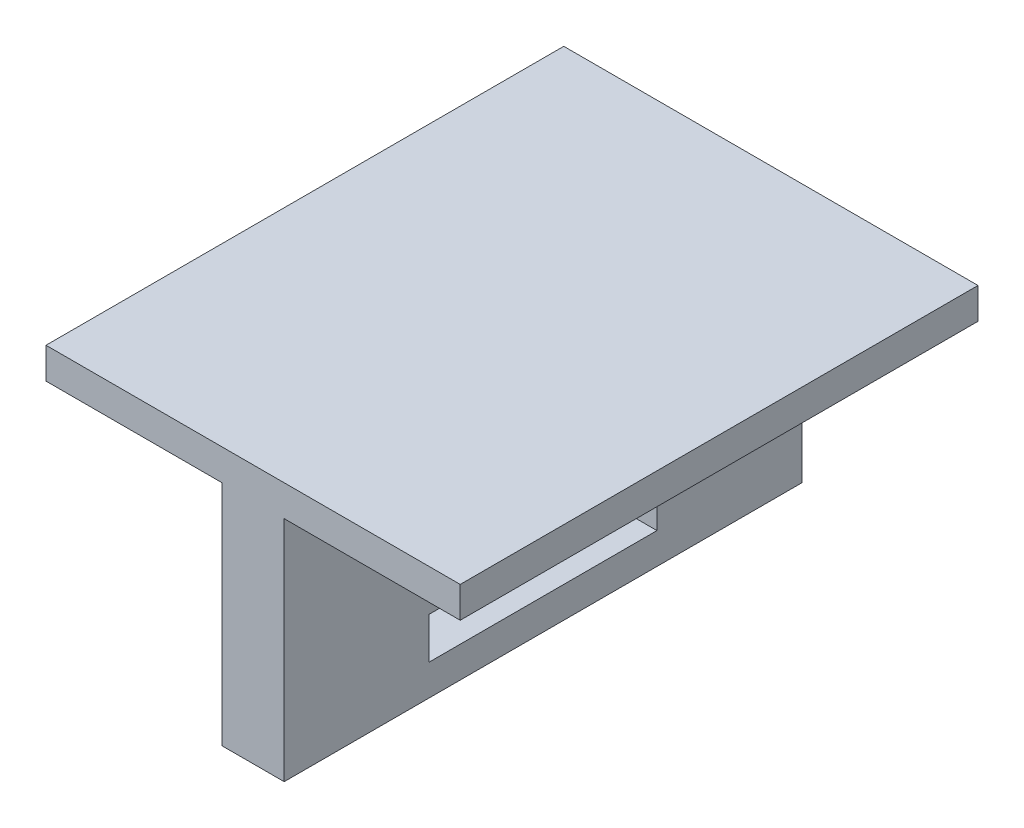
ISO-10303-21;
HEADER;
FILE_DESCRIPTION(('STEP AP214'),'2;1');
FILE_NAME('part.step','',(''),(''),'','','');
FILE_SCHEMA(('AUTOMOTIVE_DESIGN { 1 0 10303 214 1 1 1 1 }'));
ENDSEC;
DATA;
#1=APPLICATION_CONTEXT('core data for automotive mechanical design processes');
#2=APPLICATION_PROTOCOL_DEFINITION('international standard','automotive_design',2000,#1);
#3=PRODUCT_CONTEXT('',#1,'mechanical');
#4=PRODUCT('Part','Part','',(#3));
#5=PRODUCT_RELATED_PRODUCT_CATEGORY('part','',(#4));
#6=PRODUCT_DEFINITION_FORMATION('','',#4);
#7=PRODUCT_DEFINITION_CONTEXT('part definition',#1,'design');
#8=PRODUCT_DEFINITION('design','',#6,#7);
#9=PRODUCT_DEFINITION_SHAPE('','',#8);
#10=(LENGTH_UNIT() NAMED_UNIT(*) SI_UNIT(.MILLI.,.METRE.));
#11=(NAMED_UNIT(*) PLANE_ANGLE_UNIT() SI_UNIT($,.RADIAN.));
#12=(NAMED_UNIT(*) SI_UNIT($,.STERADIAN.) SOLID_ANGLE_UNIT());
#13=UNCERTAINTY_MEASURE_WITH_UNIT(LENGTH_MEASURE(1.E-05),#10,'distance_accuracy_value','');
#14=(GEOMETRIC_REPRESENTATION_CONTEXT(3) GLOBAL_UNCERTAINTY_ASSIGNED_CONTEXT((#13)) GLOBAL_UNIT_ASSIGNED_CONTEXT((#10,
#11,#12)) REPRESENTATION_CONTEXT('',''));
#15=CARTESIAN_POINT('',(0.,0.,0.));
#16=DIRECTION('',(0.,0.,1.));
#17=DIRECTION('',(1.,0.,0.));
#18=AXIS2_PLACEMENT_3D('',#15,#16,#17);
#19=CARTESIAN_POINT('',(-3.,-12.5,0.));
#20=DIRECTION('',(0.,-1.,0.));
#21=DIRECTION('',(0.,0.,-1.));
#22=AXIS2_PLACEMENT_3D('',#19,#20,#21);
#23=PLANE('',#22);
#24=DIRECTION('',(1.,0.,0.));
#25=VECTOR('',#24,1.);
#26=CARTESIAN_POINT('',(-3.,-12.5,-25.));
#27=LINE('',#26,#25);
#28=CARTESIAN_POINT('',(-3.,-12.5,-25.));
#29=VERTEX_POINT('',#28);
#30=CARTESIAN_POINT('',(3.,-12.5,-25.));
#31=VERTEX_POINT('',#30);
#32=EDGE_CURVE('E42',#29,#31,#27,.T.);
#33=ORIENTED_EDGE('',*,*,#32,.T.);
#34=DIRECTION('',(0.,0.,-1.));
#35=VECTOR('',#34,1.);
#36=CARTESIAN_POINT('',(3.,-12.5,0.));
#37=LINE('',#36,#35);
#38=CARTESIAN_POINT('',(3.,-12.5,25.));
#39=VERTEX_POINT('',#38);
#40=EDGE_CURVE('E193',#39,#31,#37,.T.);
#41=ORIENTED_EDGE('',*,*,#40,.F.);
#42=DIRECTION('',(1.,0.,0.));
#43=VECTOR('',#42,1.);
#44=CARTESIAN_POINT('',(-3.,-12.5,25.));
#45=LINE('',#44,#43);
#46=CARTESIAN_POINT('',(-3.,-12.5,25.));
#47=VERTEX_POINT('',#46);
#48=EDGE_CURVE('E11',#47,#39,#45,.T.);
#49=ORIENTED_EDGE('',*,*,#48,.F.);
#50=DIRECTION('',(0.,0.,-1.));
#51=VECTOR('',#50,1.);
#52=CARTESIAN_POINT('',(-3.,-12.5,0.));
#53=LINE('',#52,#51);
#54=EDGE_CURVE('E212',#47,#29,#53,.T.);
#55=ORIENTED_EDGE('',*,*,#54,.T.);
#56=EDGE_LOOP('',(#33,#41,#49,#55));
#57=FACE_BOUND('',#56,.T.);
#58=ADVANCED_FACE('F33',(#57),#23,.T.);
#59=CARTESIAN_POINT('',(-3.,0.,25.));
#60=DIRECTION('',(0.,0.,-1.));
#61=DIRECTION('',(-1.,0.,0.));
#62=AXIS2_PLACEMENT_3D('',#59,#60,#61);
#63=PLANE('',#62);
#64=ORIENTED_EDGE('',*,*,#48,.T.);
#65=DIRECTION('',(0.,1.,0.));
#66=VECTOR('',#65,1.);
#67=CARTESIAN_POINT('',(3.,0.,25.));
#68=LINE('',#67,#66);
#69=CARTESIAN_POINT('',(3.,9.50000000000001,25.));
#70=VERTEX_POINT('',#69);
#71=EDGE_CURVE('E185',#39,#70,#68,.T.);
#72=ORIENTED_EDGE('',*,*,#71,.T.);
#73=DIRECTION('',(1.,0.,0.));
#74=VECTOR('',#73,1.);
#75=CARTESIAN_POINT('',(-20.,9.50000000000001,25.));
#76=LINE('',#75,#74);
#77=CARTESIAN_POINT('',(20.,9.50000000000001,25.));
#78=VERTEX_POINT('',#77);
#79=EDGE_CURVE('E168',#70,#78,#76,.T.);
#80=ORIENTED_EDGE('',*,*,#79,.T.);
#81=DIRECTION('',(0.,1.,0.));
#82=VECTOR('',#81,1.);
#83=CARTESIAN_POINT('',(20.,0.,25.));
#84=LINE('',#83,#82);
#85=CARTESIAN_POINT('',(20.,12.5,25.));
#86=VERTEX_POINT('',#85);
#87=EDGE_CURVE('E150',#78,#86,#84,.T.);
#88=ORIENTED_EDGE('',*,*,#87,.T.);
#89=DIRECTION('',(1.,0.,0.));
#90=VECTOR('',#89,1.);
#91=CARTESIAN_POINT('',(-20.,12.5,25.));
#92=LINE('',#91,#90);
#93=CARTESIAN_POINT('',(-20.,12.5,25.));
#94=VERTEX_POINT('',#93);
#95=EDGE_CURVE('E164',#94,#86,#92,.T.);
#96=ORIENTED_EDGE('',*,*,#95,.F.);
#97=DIRECTION('',(0.,1.,0.));
#98=VECTOR('',#97,1.);
#99=CARTESIAN_POINT('',(-20.,0.,25.));
#100=LINE('',#99,#98);
#101=CARTESIAN_POINT('',(-20.,9.50000000000001,25.));
#102=VERTEX_POINT('',#101);
#103=EDGE_CURVE('E134',#102,#94,#100,.T.);
#104=ORIENTED_EDGE('',*,*,#103,.F.);
#105=CARTESIAN_POINT('',(-3.,9.50000000000001,25.));
#106=VERTEX_POINT('',#105);
#107=EDGE_CURVE('E171',#102,#106,#76,.T.);
#108=ORIENTED_EDGE('',*,*,#107,.T.);
#109=DIRECTION('',(0.,1.,0.));
#110=VECTOR('',#109,1.);
#111=CARTESIAN_POINT('',(-3.,0.,25.));
#112=LINE('',#111,#110);
#113=EDGE_CURVE('E221',#47,#106,#112,.T.);
#114=ORIENTED_EDGE('',*,*,#113,.F.);
#115=EDGE_LOOP('',(#64,#72,#80,#88,#96,#104,#108,#114));
#116=FACE_BOUND('',#115,.T.);
#117=ADVANCED_FACE('F183',(#116),#63,.F.);
#118=CARTESIAN_POINT('',(-3.,0.,-11.));
#119=DIRECTION('',(0.,0.,-1.));
#120=DIRECTION('',(-1.,0.,0.));
#121=AXIS2_PLACEMENT_3D('',#118,#119,#120);
#122=PLANE('',#121);
#123=DIRECTION('',(1.,0.,0.));
#124=VECTOR('',#123,1.);
#125=CARTESIAN_POINT('',(-3.,-9.5,-11.));
#126=LINE('',#125,#124);
#127=CARTESIAN_POINT('',(-3.,-9.5,-11.));
#128=VERTEX_POINT('',#127);
#129=CARTESIAN_POINT('',(3.,-9.5,-11.));
#130=VERTEX_POINT('',#129);
#131=EDGE_CURVE('E222',#128,#130,#126,.T.);
#132=ORIENTED_EDGE('',*,*,#131,.T.);
#133=DIRECTION('',(0.,1.,0.));
#134=VECTOR('',#133,1.);
#135=CARTESIAN_POINT('',(3.,0.,-11.));
#136=LINE('',#135,#134);
#137=CARTESIAN_POINT('',(3.,-5.5,-11.));
#138=VERTEX_POINT('',#137);
#139=EDGE_CURVE('E173',#130,#138,#136,.T.);
#140=ORIENTED_EDGE('',*,*,#139,.T.);
#141=DIRECTION('',(1.,0.,0.));
#142=VECTOR('',#141,1.);
#143=CARTESIAN_POINT('',(-3.,-5.5,-11.));
#144=LINE('',#143,#142);
#145=CARTESIAN_POINT('',(-3.,-5.5,-11.));
#146=VERTEX_POINT('',#145);
#147=EDGE_CURVE('E240',#146,#138,#144,.T.);
#148=ORIENTED_EDGE('',*,*,#147,.F.);
#149=DIRECTION('',(0.,1.,0.));
#150=VECTOR('',#149,1.);
#151=CARTESIAN_POINT('',(-3.,0.,-11.));
#152=LINE('',#151,#150);
#153=EDGE_CURVE('E191',#128,#146,#152,.T.);
#154=ORIENTED_EDGE('',*,*,#153,.F.);
#155=EDGE_LOOP('',(#132,#140,#148,#154));
#156=FACE_BOUND('',#155,.T.);
#157=ADVANCED_FACE('F35',(#156),#122,.F.);
#158=CARTESIAN_POINT('',(-3.,-5.5,0.));
#159=DIRECTION('',(0.,-1.,0.));
#160=DIRECTION('',(0.,0.,-1.));
#161=AXIS2_PLACEMENT_3D('',#158,#159,#160);
#162=PLANE('',#161);
#163=ORIENTED_EDGE('',*,*,#147,.T.);
#164=DIRECTION('',(0.,0.,-1.));
#165=VECTOR('',#164,1.);
#166=CARTESIAN_POINT('',(3.,-5.5,0.));
#167=LINE('',#166,#165);
#168=CARTESIAN_POINT('',(3.,-5.5,11.));
#169=VERTEX_POINT('',#168);
#170=EDGE_CURVE('E244',#169,#138,#167,.T.);
#171=ORIENTED_EDGE('',*,*,#170,.F.);
#172=DIRECTION('',(1.,0.,0.));
#173=VECTOR('',#172,1.);
#174=CARTESIAN_POINT('',(-3.,-5.5,11.));
#175=LINE('',#174,#173);
#176=CARTESIAN_POINT('',(-3.,-5.5,11.));
#177=VERTEX_POINT('',#176);
#178=EDGE_CURVE('E235',#177,#169,#175,.T.);
#179=ORIENTED_EDGE('',*,*,#178,.F.);
#180=DIRECTION('',(0.,0.,-1.));
#181=VECTOR('',#180,1.);
#182=CARTESIAN_POINT('',(-3.,-5.5,0.));
#183=LINE('',#182,#181);
#184=EDGE_CURVE('E209',#177,#146,#183,.T.);
#185=ORIENTED_EDGE('',*,*,#184,.T.);
#186=EDGE_LOOP('',(#163,#171,#179,#185));
#187=FACE_BOUND('',#186,.T.);
#188=ADVANCED_FACE('F263',(#187),#162,.T.);
#189=CARTESIAN_POINT('',(-3.,0.,11.));
#190=DIRECTION('',(0.,0.,-1.));
#191=DIRECTION('',(-1.,0.,0.));
#192=AXIS2_PLACEMENT_3D('',#189,#190,#191);
#193=PLANE('',#192);
#194=ORIENTED_EDGE('',*,*,#178,.T.);
#195=DIRECTION('',(0.,1.,0.));
#196=VECTOR('',#195,1.);
#197=CARTESIAN_POINT('',(3.,0.,11.));
#198=LINE('',#197,#196);
#199=CARTESIAN_POINT('',(3.,-9.5,11.));
#200=VERTEX_POINT('',#199);
#201=EDGE_CURVE('E246',#200,#169,#198,.T.);
#202=ORIENTED_EDGE('',*,*,#201,.F.);
#203=DIRECTION('',(1.,0.,0.));
#204=VECTOR('',#203,1.);
#205=CARTESIAN_POINT('',(-3.,-9.5,11.));
#206=LINE('',#205,#204);
#207=CARTESIAN_POINT('',(-3.,-9.5,11.));
#208=VERTEX_POINT('',#207);
#209=EDGE_CURVE('E229',#208,#200,#206,.T.);
#210=ORIENTED_EDGE('',*,*,#209,.F.);
#211=DIRECTION('',(0.,1.,0.));
#212=VECTOR('',#211,1.);
#213=CARTESIAN_POINT('',(-3.,0.,11.));
#214=LINE('',#213,#212);
#215=EDGE_CURVE('E206',#208,#177,#214,.T.);
#216=ORIENTED_EDGE('',*,*,#215,.T.);
#217=EDGE_LOOP('',(#194,#202,#210,#216));
#218=FACE_BOUND('',#217,.T.);
#219=ADVANCED_FACE('F261',(#218),#193,.T.);
#220=CARTESIAN_POINT('',(-3.,-9.5,0.));
#221=DIRECTION('',(0.,-1.,0.));
#222=DIRECTION('',(0.,0.,-1.));
#223=AXIS2_PLACEMENT_3D('',#220,#221,#222);
#224=PLANE('',#223);
#225=ORIENTED_EDGE('',*,*,#209,.T.);
#226=DIRECTION('',(0.,0.,-1.));
#227=VECTOR('',#226,1.);
#228=CARTESIAN_POINT('',(3.,-9.5,0.));
#229=LINE('',#228,#227);
#230=EDGE_CURVE('E250',#200,#130,#229,.T.);
#231=ORIENTED_EDGE('',*,*,#230,.T.);
#232=ORIENTED_EDGE('',*,*,#131,.F.);
#233=DIRECTION('',(0.,0.,-1.));
#234=VECTOR('',#233,1.);
#235=CARTESIAN_POINT('',(-3.,-9.5,0.));
#236=LINE('',#235,#234);
#237=EDGE_CURVE('E204',#208,#128,#236,.T.);
#238=ORIENTED_EDGE('',*,*,#237,.F.);
#239=EDGE_LOOP('',(#225,#231,#232,#238));
#240=FACE_BOUND('',#239,.T.);
#241=ADVANCED_FACE('F255',(#240),#224,.F.);
#242=CARTESIAN_POINT('',(-3.,0.,-25.));
#243=DIRECTION('',(0.,0.,-1.));
#244=DIRECTION('',(-1.,0.,0.));
#245=AXIS2_PLACEMENT_3D('',#242,#243,#244);
#246=PLANE('',#245);
#247=DIRECTION('',(0.,1.,0.));
#248=VECTOR('',#247,1.);
#249=CARTESIAN_POINT('',(-3.,0.,-25.));
#250=LINE('',#249,#248);
#251=CARTESIAN_POINT('',(-3.,9.50000000000001,-25.));
#252=VERTEX_POINT('',#251);
#253=EDGE_CURVE('E214',#29,#252,#250,.T.);
#254=ORIENTED_EDGE('',*,*,#253,.T.);
#255=DIRECTION('',(1.,0.,0.));
#256=VECTOR('',#255,1.);
#257=CARTESIAN_POINT('',(-20.,9.50000000000001,-25.));
#258=LINE('',#257,#256);
#259=CARTESIAN_POINT('',(-20.,9.50000000000001,-25.));
#260=VERTEX_POINT('',#259);
#261=EDGE_CURVE('E56',#260,#252,#258,.T.);
#262=ORIENTED_EDGE('',*,*,#261,.F.);
#263=DIRECTION('',(0.,1.,0.));
#264=VECTOR('',#263,1.);
#265=CARTESIAN_POINT('',(-20.,0.,-25.));
#266=LINE('',#265,#264);
#267=CARTESIAN_POINT('',(-20.,12.5,-25.));
#268=VERTEX_POINT('',#267);
#269=EDGE_CURVE('E157',#260,#268,#266,.T.);
#270=ORIENTED_EDGE('',*,*,#269,.T.);
#271=DIRECTION('',(1.,0.,0.));
#272=VECTOR('',#271,1.);
#273=CARTESIAN_POINT('',(-20.,12.5,-25.));
#274=LINE('',#273,#272);
#275=CARTESIAN_POINT('',(20.,12.5,-25.));
#276=VERTEX_POINT('',#275);
#277=EDGE_CURVE('E142',#268,#276,#274,.T.);
#278=ORIENTED_EDGE('',*,*,#277,.T.);
#279=DIRECTION('',(0.,1.,0.));
#280=VECTOR('',#279,1.);
#281=CARTESIAN_POINT('',(20.,0.,-25.));
#282=LINE('',#281,#280);
#283=CARTESIAN_POINT('',(20.,9.50000000000001,-25.));
#284=VERTEX_POINT('',#283);
#285=EDGE_CURVE('E137',#284,#276,#282,.T.);
#286=ORIENTED_EDGE('',*,*,#285,.F.);
#287=CARTESIAN_POINT('',(3.,9.50000000000001,-25.));
#288=VERTEX_POINT('',#287);
#289=EDGE_CURVE('E123',#288,#284,#258,.T.);
#290=ORIENTED_EDGE('',*,*,#289,.F.);
#291=DIRECTION('',(0.,1.,0.));
#292=VECTOR('',#291,1.);
#293=CARTESIAN_POINT('',(3.,0.,-25.));
#294=LINE('',#293,#292);
#295=EDGE_CURVE('E189',#31,#288,#294,.T.);
#296=ORIENTED_EDGE('',*,*,#295,.F.);
#297=ORIENTED_EDGE('',*,*,#32,.F.);
#298=EDGE_LOOP('',(#254,#262,#270,#278,#286,#290,#296,#297));
#299=FACE_BOUND('',#298,.T.);
#300=ADVANCED_FACE('F139',(#299),#246,.T.);
#301=CARTESIAN_POINT('',(-3.,0.,0.));
#302=DIRECTION('',(1.,0.,0.));
#303=DIRECTION('',(0.,0.,-1.));
#304=AXIS2_PLACEMENT_3D('',#301,#302,#303);
#305=PLANE('',#304);
#306=ORIENTED_EDGE('',*,*,#153,.T.);
#307=ORIENTED_EDGE('',*,*,#184,.F.);
#308=ORIENTED_EDGE('',*,*,#215,.F.);
#309=ORIENTED_EDGE('',*,*,#237,.T.);
#310=EDGE_LOOP('',(#306,#307,#308,#309));
#311=FACE_BOUND('',#310,.T.);
#312=ORIENTED_EDGE('',*,*,#54,.F.);
#313=ORIENTED_EDGE('',*,*,#113,.T.);
#314=DIRECTION('',(0.,0.,-1.));
#315=VECTOR('',#314,1.);
#316=CARTESIAN_POINT('',(-3.,9.50000000000001,0.));
#317=LINE('',#316,#315);
#318=EDGE_CURVE('E218',#106,#252,#317,.T.);
#319=ORIENTED_EDGE('',*,*,#318,.T.);
#320=ORIENTED_EDGE('',*,*,#253,.F.);
#321=EDGE_LOOP('',(#312,#313,#319,#320));
#322=FACE_BOUND('',#321,.T.);
#323=ADVANCED_FACE('F259',(#311,#322),#305,.F.);
#324=CARTESIAN_POINT('',(3.,0.,0.));
#325=DIRECTION('',(1.,0.,0.));
#326=DIRECTION('',(0.,0.,-1.));
#327=AXIS2_PLACEMENT_3D('',#324,#325,#326);
#328=PLANE('',#327);
#329=ORIENTED_EDGE('',*,*,#139,.F.);
#330=ORIENTED_EDGE('',*,*,#230,.F.);
#331=ORIENTED_EDGE('',*,*,#201,.T.);
#332=ORIENTED_EDGE('',*,*,#170,.T.);
#333=EDGE_LOOP('',(#329,#330,#331,#332));
#334=FACE_BOUND('',#333,.T.);
#335=ORIENTED_EDGE('',*,*,#40,.T.);
#336=ORIENTED_EDGE('',*,*,#295,.T.);
#337=DIRECTION('',(0.,0.,-1.));
#338=VECTOR('',#337,1.);
#339=CARTESIAN_POINT('',(3.,9.50000000000001,0.));
#340=LINE('',#339,#338);
#341=EDGE_CURVE('E130',#70,#288,#340,.T.);
#342=ORIENTED_EDGE('',*,*,#341,.F.);
#343=ORIENTED_EDGE('',*,*,#71,.F.);
#344=EDGE_LOOP('',(#335,#336,#342,#343));
#345=FACE_BOUND('',#344,.T.);
#346=ADVANCED_FACE('F188',(#334,#345),#328,.T.);
#347=CARTESIAN_POINT('',(-20.,9.50000000000001,0.));
#348=DIRECTION('',(0.,-1.,0.));
#349=DIRECTION('',(0.,0.,-1.));
#350=AXIS2_PLACEMENT_3D('',#347,#348,#349);
#351=PLANE('',#350);
#352=ORIENTED_EDGE('',*,*,#318,.F.);
#353=ORIENTED_EDGE('',*,*,#107,.F.);
#354=DIRECTION('',(0.,0.,-1.));
#355=VECTOR('',#354,1.);
#356=CARTESIAN_POINT('',(-20.,9.50000000000001,0.));
#357=LINE('',#356,#355);
#358=EDGE_CURVE('E155',#102,#260,#357,.T.);
#359=ORIENTED_EDGE('',*,*,#358,.T.);
#360=ORIENTED_EDGE('',*,*,#261,.T.);
#361=EDGE_LOOP('',(#352,#353,#359,#360));
#362=FACE_BOUND('',#361,.T.);
#363=ADVANCED_FACE('F284',(#362),#351,.T.);
#364=ORIENTED_EDGE('',*,*,#79,.F.);
#365=ORIENTED_EDGE('',*,*,#341,.T.);
#366=ORIENTED_EDGE('',*,*,#289,.T.);
#367=DIRECTION('',(0.,0.,-1.));
#368=VECTOR('',#367,1.);
#369=CARTESIAN_POINT('',(20.,9.50000000000001,0.));
#370=LINE('',#369,#368);
#371=EDGE_CURVE('E127',#78,#284,#370,.T.);
#372=ORIENTED_EDGE('',*,*,#371,.F.);
#373=EDGE_LOOP('',(#364,#365,#366,#372));
#374=FACE_BOUND('',#373,.T.);
#375=ADVANCED_FACE('F125',(#374),#351,.T.);
#376=CARTESIAN_POINT('',(-20.,12.5,0.));
#377=DIRECTION('',(0.,-1.,0.));
#378=DIRECTION('',(0.,0.,-1.));
#379=AXIS2_PLACEMENT_3D('',#376,#377,#378);
#380=PLANE('',#379);
#381=ORIENTED_EDGE('',*,*,#95,.T.);
#382=DIRECTION('',(0.,0.,-1.));
#383=VECTOR('',#382,1.);
#384=CARTESIAN_POINT('',(20.,12.5,0.));
#385=LINE('',#384,#383);
#386=EDGE_CURVE('E146',#86,#276,#385,.T.);
#387=ORIENTED_EDGE('',*,*,#386,.T.);
#388=ORIENTED_EDGE('',*,*,#277,.F.);
#389=DIRECTION('',(0.,0.,-1.));
#390=VECTOR('',#389,1.);
#391=CARTESIAN_POINT('',(-20.,12.5,0.));
#392=LINE('',#391,#390);
#393=EDGE_CURVE('E159',#94,#268,#392,.T.);
#394=ORIENTED_EDGE('',*,*,#393,.F.);
#395=EDGE_LOOP('',(#381,#387,#388,#394));
#396=FACE_BOUND('',#395,.T.);
#397=ADVANCED_FACE('F287',(#396),#380,.F.);
#398=CARTESIAN_POINT('',(-20.,0.,0.));
#399=DIRECTION('',(1.,0.,0.));
#400=DIRECTION('',(0.,0.,-1.));
#401=AXIS2_PLACEMENT_3D('',#398,#399,#400);
#402=PLANE('',#401);
#403=ORIENTED_EDGE('',*,*,#358,.F.);
#404=ORIENTED_EDGE('',*,*,#103,.T.);
#405=ORIENTED_EDGE('',*,*,#393,.T.);
#406=ORIENTED_EDGE('',*,*,#269,.F.);
#407=EDGE_LOOP('',(#403,#404,#405,#406));
#408=FACE_BOUND('',#407,.T.);
#409=ADVANCED_FACE('F290',(#408),#402,.F.);
#410=CARTESIAN_POINT('',(20.,0.,0.));
#411=DIRECTION('',(1.,0.,0.));
#412=DIRECTION('',(0.,0.,-1.));
#413=AXIS2_PLACEMENT_3D('',#410,#411,#412);
#414=PLANE('',#413);
#415=ORIENTED_EDGE('',*,*,#371,.T.);
#416=ORIENTED_EDGE('',*,*,#285,.T.);
#417=ORIENTED_EDGE('',*,*,#386,.F.);
#418=ORIENTED_EDGE('',*,*,#87,.F.);
#419=EDGE_LOOP('',(#415,#416,#417,#418));
#420=FACE_BOUND('',#419,.T.);
#421=ADVANCED_FACE('F148',(#420),#414,.T.);
#422=CLOSED_SHELL('',(#58,#117,#157,#188,#219,#241,#300,#323,#346,#363,#375,#397,#409,#421));
#423=MANIFOLD_SOLID_BREP('B2',#422);
#424=ADVANCED_BREP_SHAPE_REPRESENTATION('',(#18,#423),#14);
#425=SHAPE_DEFINITION_REPRESENTATION(#9,#424);
ENDSEC;
END-ISO-10303-21;
